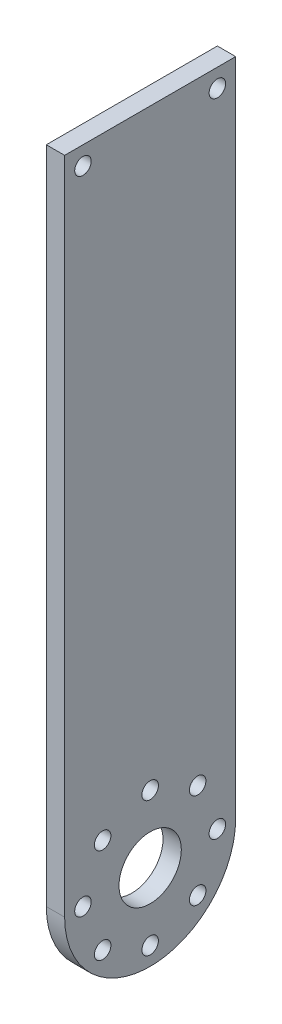
ISO-10303-21;
HEADER;
FILE_DESCRIPTION(('STEP AP214'),'2;1');
FILE_NAME('part.step','',(''),(''),'','','');
FILE_SCHEMA(('AUTOMOTIVE_DESIGN { 1 0 10303 214 1 1 1 1 }'));
ENDSEC;
DATA;
#1=APPLICATION_CONTEXT('core data for automotive mechanical design processes');
#2=APPLICATION_PROTOCOL_DEFINITION('international standard','automotive_design',2000,#1);
#3=PRODUCT_CONTEXT('',#1,'mechanical');
#4=PRODUCT('Part','Part','',(#3));
#5=PRODUCT_RELATED_PRODUCT_CATEGORY('part','',(#4));
#6=PRODUCT_DEFINITION_FORMATION('','',#4);
#7=PRODUCT_DEFINITION_CONTEXT('part definition',#1,'design');
#8=PRODUCT_DEFINITION('design','',#6,#7);
#9=PRODUCT_DEFINITION_SHAPE('','',#8);
#10=(LENGTH_UNIT() NAMED_UNIT(*) SI_UNIT(.MILLI.,.METRE.));
#11=(NAMED_UNIT(*) PLANE_ANGLE_UNIT() SI_UNIT($,.RADIAN.));
#12=(NAMED_UNIT(*) SI_UNIT($,.STERADIAN.) SOLID_ANGLE_UNIT());
#13=UNCERTAINTY_MEASURE_WITH_UNIT(LENGTH_MEASURE(1.E-05),#10,'distance_accuracy_value','');
#14=(GEOMETRIC_REPRESENTATION_CONTEXT(3) GLOBAL_UNCERTAINTY_ASSIGNED_CONTEXT((#13)) GLOBAL_UNIT_ASSIGNED_CONTEXT((#10,
#11,#12)) REPRESENTATION_CONTEXT('',''));
#15=CARTESIAN_POINT('',(0.,0.,0.));
#16=DIRECTION('',(0.,0.,1.));
#17=DIRECTION('',(1.,0.,0.));
#18=AXIS2_PLACEMENT_3D('',#15,#16,#17);
#19=CARTESIAN_POINT('',(3.,0.,0.));
#20=DIRECTION('',(1.,0.,0.));
#21=DIRECTION('',(0.,0.,-1.));
#22=AXIS2_PLACEMENT_3D('',#19,#20,#21);
#23=PLANE('',#22);
#24=CARTESIAN_POINT('',(3.,105.,11.));
#25=DIRECTION('',(1.,0.,0.));
#26=DIRECTION('',(0.,0.,-1.));
#27=AXIS2_PLACEMENT_3D('',#24,#25,#26);
#28=CIRCLE('',#27,1.35);
#29=CARTESIAN_POINT('',(3.,105.,9.65));
#30=VERTEX_POINT('',#29);
#31=EDGE_CURVE('E164',#30,#30,#28,.T.);
#32=ORIENTED_EDGE('',*,*,#31,.F.);
#33=EDGE_LOOP('',(#32));
#34=FACE_BOUND('',#33,.T.);
#35=CARTESIAN_POINT('',(3.,-1.15218884181823E-13,-11.));
#36=DIRECTION('',(1.,0.,0.));
#37=DIRECTION('',(0.,0.,-1.));
#38=AXIS2_PLACEMENT_3D('',#35,#36,#37);
#39=CIRCLE('',#38,1.35);
#40=CARTESIAN_POINT('',(3.,-1.15218884181823E-13,-12.35));
#41=VERTEX_POINT('',#40);
#42=EDGE_CURVE('E152',#41,#41,#39,.T.);
#43=ORIENTED_EDGE('',*,*,#42,.F.);
#44=EDGE_LOOP('',(#43));
#45=FACE_BOUND('',#44,.T.);
#46=CARTESIAN_POINT('',(3.,11.,0.));
#47=DIRECTION('',(1.,0.,0.));
#48=DIRECTION('',(0.,0.,-1.));
#49=AXIS2_PLACEMENT_3D('',#46,#47,#48);
#50=CIRCLE('',#49,1.35);
#51=CARTESIAN_POINT('',(3.,11.,-1.35000000000008));
#52=VERTEX_POINT('',#51);
#53=EDGE_CURVE('E140',#52,#52,#50,.T.);
#54=ORIENTED_EDGE('',*,*,#53,.F.);
#55=EDGE_LOOP('',(#54));
#56=FACE_BOUND('',#55,.T.);
#57=CARTESIAN_POINT('',(3.,0.,11.));
#58=DIRECTION('',(1.,0.,0.));
#59=DIRECTION('',(0.,0.,-1.));
#60=AXIS2_PLACEMENT_3D('',#57,#58,#59);
#61=CIRCLE('',#60,1.35);
#62=CARTESIAN_POINT('',(3.,0.,9.65));
#63=VERTEX_POINT('',#62);
#64=EDGE_CURVE('E128',#63,#63,#61,.T.);
#65=ORIENTED_EDGE('',*,*,#64,.F.);
#66=EDGE_LOOP('',(#65));
#67=FACE_BOUND('',#66,.T.);
#68=CARTESIAN_POINT('',(3.,0.,0.));
#69=DIRECTION('',(1.,0.,0.));
#70=DIRECTION('',(0.,0.,-1.));
#71=AXIS2_PLACEMENT_3D('',#68,#69,#70);
#72=CIRCLE('',#71,5.1);
#73=CARTESIAN_POINT('',(3.,0.,-5.1));
#74=VERTEX_POINT('',#73);
#75=EDGE_CURVE('E116',#74,#74,#72,.T.);
#76=ORIENTED_EDGE('',*,*,#75,.F.);
#77=EDGE_LOOP('',(#76));
#78=FACE_BOUND('',#77,.T.);
#79=CARTESIAN_POINT('',(3.,0.,0.));
#80=DIRECTION('',(1.,0.,0.));
#81=DIRECTION('',(0.,0.,-1.));
#82=AXIS2_PLACEMENT_3D('',#79,#80,#81);
#83=CIRCLE('',#82,14.);
#84=CARTESIAN_POINT('',(3.,0.,14.));
#85=VERTEX_POINT('',#84);
#86=CARTESIAN_POINT('',(3.,0.,-14.));
#87=VERTEX_POINT('',#86);
#88=EDGE_CURVE('E86',#85,#87,#83,.T.);
#89=ORIENTED_EDGE('',*,*,#88,.T.);
#90=DIRECTION('',(0.,1.,0.));
#91=VECTOR('',#90,1.);
#92=CARTESIAN_POINT('',(3.,0.,-14.));
#93=LINE('',#92,#91);
#94=CARTESIAN_POINT('',(3.,108.,-14.));
#95=VERTEX_POINT('',#94);
#96=EDGE_CURVE('E81',#87,#95,#93,.T.);
#97=ORIENTED_EDGE('',*,*,#96,.T.);
#98=DIRECTION('',(0.,0.,1.));
#99=VECTOR('',#98,1.);
#100=CARTESIAN_POINT('',(3.,108.,14.));
#101=LINE('',#100,#99);
#102=CARTESIAN_POINT('',(3.,108.,14.));
#103=VERTEX_POINT('',#102);
#104=EDGE_CURVE('E84',#95,#103,#101,.T.);
#105=ORIENTED_EDGE('',*,*,#104,.T.);
#106=DIRECTION('',(0.,-1.,0.));
#107=VECTOR('',#106,1.);
#108=CARTESIAN_POINT('',(3.,0.,14.));
#109=LINE('',#108,#107);
#110=EDGE_CURVE('E51',#103,#85,#109,.T.);
#111=ORIENTED_EDGE('',*,*,#110,.T.);
#112=EDGE_LOOP('',(#89,#97,#105,#111));
#113=FACE_BOUND('',#112,.T.);
#114=CARTESIAN_POINT('',(3.,-11.,0.));
#115=DIRECTION('',(1.,0.,0.));
#116=DIRECTION('',(0.,0.,-1.));
#117=AXIS2_PLACEMENT_3D('',#114,#115,#116);
#118=CIRCLE('',#117,1.35);
#119=CARTESIAN_POINT('',(3.,-11.,-1.35));
#120=VERTEX_POINT('',#119);
#121=EDGE_CURVE('E101',#120,#120,#118,.T.);
#122=ORIENTED_EDGE('',*,*,#121,.F.);
#123=EDGE_LOOP('',(#122));
#124=FACE_BOUND('',#123,.T.);
#125=CARTESIAN_POINT('',(3.,-7.77817459305201,7.77817459305203));
#126=DIRECTION('',(1.,0.,0.));
#127=DIRECTION('',(0.,0.,-1.));
#128=AXIS2_PLACEMENT_3D('',#125,#126,#127);
#129=CIRCLE('',#128,1.35);
#130=CARTESIAN_POINT('',(3.,-7.77817459305201,6.42817459305203));
#131=VERTEX_POINT('',#130);
#132=EDGE_CURVE('E122',#131,#131,#129,.T.);
#133=ORIENTED_EDGE('',*,*,#132,.F.);
#134=EDGE_LOOP('',(#133));
#135=FACE_BOUND('',#134,.T.);
#136=CARTESIAN_POINT('',(3.,7.77817459305206,7.77817459305199));
#137=DIRECTION('',(1.,0.,0.));
#138=DIRECTION('',(0.,0.,-1.));
#139=AXIS2_PLACEMENT_3D('',#136,#137,#138);
#140=CIRCLE('',#139,1.35);
#141=CARTESIAN_POINT('',(3.,7.77817459305206,6.42817459305199));
#142=VERTEX_POINT('',#141);
#143=EDGE_CURVE('E134',#142,#142,#140,.T.);
#144=ORIENTED_EDGE('',*,*,#143,.F.);
#145=EDGE_LOOP('',(#144));
#146=FACE_BOUND('',#145,.T.);
#147=CARTESIAN_POINT('',(3.,7.77817459305195,-7.77817459305209));
#148=DIRECTION('',(1.,0.,0.));
#149=DIRECTION('',(0.,0.,-1.));
#150=AXIS2_PLACEMENT_3D('',#147,#148,#149);
#151=CIRCLE('',#150,1.35);
#152=CARTESIAN_POINT('',(3.,7.77817459305195,-9.12817459305209));
#153=VERTEX_POINT('',#152);
#154=EDGE_CURVE('E146',#153,#153,#151,.T.);
#155=ORIENTED_EDGE('',*,*,#154,.F.);
#156=EDGE_LOOP('',(#155));
#157=FACE_BOUND('',#156,.T.);
#158=CARTESIAN_POINT('',(3.,-7.77817459305212,-7.77817459305193));
#159=DIRECTION('',(1.,0.,0.));
#160=DIRECTION('',(0.,0.,-1.));
#161=AXIS2_PLACEMENT_3D('',#158,#159,#160);
#162=CIRCLE('',#161,1.35);
#163=CARTESIAN_POINT('',(3.,-7.77817459305212,-9.12817459305193));
#164=VERTEX_POINT('',#163);
#165=EDGE_CURVE('E158',#164,#164,#162,.T.);
#166=ORIENTED_EDGE('',*,*,#165,.F.);
#167=EDGE_LOOP('',(#166));
#168=FACE_BOUND('',#167,.T.);
#169=CARTESIAN_POINT('',(3.,105.,-11.));
#170=DIRECTION('',(1.,0.,0.));
#171=DIRECTION('',(0.,0.,1.));
#172=AXIS2_PLACEMENT_3D('',#169,#170,#171);
#173=CIRCLE('',#172,1.35);
#174=CARTESIAN_POINT('',(3.,105.,-9.65));
#175=VERTEX_POINT('',#174);
#176=EDGE_CURVE('E170',#175,#175,#173,.T.);
#177=ORIENTED_EDGE('',*,*,#176,.F.);
#178=EDGE_LOOP('',(#177));
#179=FACE_BOUND('',#178,.T.);
#180=ADVANCED_FACE('F34',(#34,#45,#56,#67,#78,#113,#124,#135,#146,#157,#168,#179),#23,.T.);
#181=CARTESIAN_POINT('',(0.,0.,0.));
#182=DIRECTION('',(1.,0.,0.));
#183=DIRECTION('',(0.,0.,-1.));
#184=AXIS2_PLACEMENT_3D('',#181,#182,#183);
#185=PLANE('',#184);
#186=CARTESIAN_POINT('',(0.,0.,0.));
#187=DIRECTION('',(1.,0.,0.));
#188=DIRECTION('',(0.,0.,-1.));
#189=AXIS2_PLACEMENT_3D('',#186,#187,#188);
#190=CIRCLE('',#189,14.);
#191=CARTESIAN_POINT('',(0.,0.,14.));
#192=VERTEX_POINT('',#191);
#193=CARTESIAN_POINT('',(0.,0.,-14.));
#194=VERTEX_POINT('',#193);
#195=EDGE_CURVE('E98',#192,#194,#190,.T.);
#196=ORIENTED_EDGE('',*,*,#195,.F.);
#197=DIRECTION('',(0.,-1.,0.));
#198=VECTOR('',#197,1.);
#199=CARTESIAN_POINT('',(0.,0.,14.));
#200=LINE('',#199,#198);
#201=CARTESIAN_POINT('',(0.,108.,14.));
#202=VERTEX_POINT('',#201);
#203=EDGE_CURVE('E74',#202,#192,#200,.T.);
#204=ORIENTED_EDGE('',*,*,#203,.F.);
#205=DIRECTION('',(0.,0.,1.));
#206=VECTOR('',#205,1.);
#207=CARTESIAN_POINT('',(0.,108.,14.));
#208=LINE('',#207,#206);
#209=CARTESIAN_POINT('',(0.,108.,-14.));
#210=VERTEX_POINT('',#209);
#211=EDGE_CURVE('E68',#210,#202,#208,.T.);
#212=ORIENTED_EDGE('',*,*,#211,.F.);
#213=DIRECTION('',(0.,1.,0.));
#214=VECTOR('',#213,1.);
#215=CARTESIAN_POINT('',(0.,0.,-14.));
#216=LINE('',#215,#214);
#217=EDGE_CURVE('E90',#194,#210,#216,.T.);
#218=ORIENTED_EDGE('',*,*,#217,.F.);
#219=EDGE_LOOP('',(#196,#204,#212,#218));
#220=FACE_BOUND('',#219,.T.);
#221=CARTESIAN_POINT('',(0.,-11.,0.));
#222=DIRECTION('',(1.,0.,0.));
#223=DIRECTION('',(0.,0.,-1.));
#224=AXIS2_PLACEMENT_3D('',#221,#222,#223);
#225=CIRCLE('',#224,1.35);
#226=CARTESIAN_POINT('',(0.,-11.,-1.35));
#227=VERTEX_POINT('',#226);
#228=EDGE_CURVE('E113',#227,#227,#225,.T.);
#229=ORIENTED_EDGE('',*,*,#228,.T.);
#230=EDGE_LOOP('',(#229));
#231=FACE_BOUND('',#230,.T.);
#232=CARTESIAN_POINT('',(0.,0.,0.));
#233=DIRECTION('',(1.,0.,0.));
#234=DIRECTION('',(0.,0.,-1.));
#235=AXIS2_PLACEMENT_3D('',#232,#233,#234);
#236=CIRCLE('',#235,5.1);
#237=CARTESIAN_POINT('',(0.,0.,-5.1));
#238=VERTEX_POINT('',#237);
#239=EDGE_CURVE('E119',#238,#238,#236,.T.);
#240=ORIENTED_EDGE('',*,*,#239,.T.);
#241=EDGE_LOOP('',(#240));
#242=FACE_BOUND('',#241,.T.);
#243=CARTESIAN_POINT('',(0.,-7.77817459305201,7.77817459305203));
#244=DIRECTION('',(1.,0.,0.));
#245=DIRECTION('',(0.,0.,-1.));
#246=AXIS2_PLACEMENT_3D('',#243,#244,#245);
#247=CIRCLE('',#246,1.35);
#248=CARTESIAN_POINT('',(0.,-7.77817459305201,6.42817459305203));
#249=VERTEX_POINT('',#248);
#250=EDGE_CURVE('E125',#249,#249,#247,.T.);
#251=ORIENTED_EDGE('',*,*,#250,.T.);
#252=EDGE_LOOP('',(#251));
#253=FACE_BOUND('',#252,.T.);
#254=CARTESIAN_POINT('',(0.,0.,11.));
#255=DIRECTION('',(1.,0.,0.));
#256=DIRECTION('',(0.,0.,-1.));
#257=AXIS2_PLACEMENT_3D('',#254,#255,#256);
#258=CIRCLE('',#257,1.35);
#259=CARTESIAN_POINT('',(0.,0.,9.65));
#260=VERTEX_POINT('',#259);
#261=EDGE_CURVE('E131',#260,#260,#258,.T.);
#262=ORIENTED_EDGE('',*,*,#261,.T.);
#263=EDGE_LOOP('',(#262));
#264=FACE_BOUND('',#263,.T.);
#265=CARTESIAN_POINT('',(0.,7.77817459305206,7.77817459305199));
#266=DIRECTION('',(1.,0.,0.));
#267=DIRECTION('',(0.,0.,-1.));
#268=AXIS2_PLACEMENT_3D('',#265,#266,#267);
#269=CIRCLE('',#268,1.35);
#270=CARTESIAN_POINT('',(0.,7.77817459305206,6.42817459305199));
#271=VERTEX_POINT('',#270);
#272=EDGE_CURVE('E137',#271,#271,#269,.T.);
#273=ORIENTED_EDGE('',*,*,#272,.T.);
#274=EDGE_LOOP('',(#273));
#275=FACE_BOUND('',#274,.T.);
#276=CARTESIAN_POINT('',(0.,11.,0.));
#277=DIRECTION('',(1.,0.,0.));
#278=DIRECTION('',(0.,0.,-1.));
#279=AXIS2_PLACEMENT_3D('',#276,#277,#278);
#280=CIRCLE('',#279,1.35);
#281=CARTESIAN_POINT('',(0.,11.,-1.35000000000008));
#282=VERTEX_POINT('',#281);
#283=EDGE_CURVE('E143',#282,#282,#280,.T.);
#284=ORIENTED_EDGE('',*,*,#283,.T.);
#285=EDGE_LOOP('',(#284));
#286=FACE_BOUND('',#285,.T.);
#287=CARTESIAN_POINT('',(0.,7.77817459305195,-7.77817459305209));
#288=DIRECTION('',(1.,0.,0.));
#289=DIRECTION('',(0.,0.,-1.));
#290=AXIS2_PLACEMENT_3D('',#287,#288,#289);
#291=CIRCLE('',#290,1.35);
#292=CARTESIAN_POINT('',(0.,7.77817459305195,-9.12817459305209));
#293=VERTEX_POINT('',#292);
#294=EDGE_CURVE('E149',#293,#293,#291,.T.);
#295=ORIENTED_EDGE('',*,*,#294,.T.);
#296=EDGE_LOOP('',(#295));
#297=FACE_BOUND('',#296,.T.);
#298=CARTESIAN_POINT('',(0.,-1.15218884181823E-13,-11.));
#299=DIRECTION('',(1.,0.,0.));
#300=DIRECTION('',(0.,0.,-1.));
#301=AXIS2_PLACEMENT_3D('',#298,#299,#300);
#302=CIRCLE('',#301,1.35);
#303=CARTESIAN_POINT('',(0.,-1.15218884181823E-13,-12.35));
#304=VERTEX_POINT('',#303);
#305=EDGE_CURVE('E155',#304,#304,#302,.T.);
#306=ORIENTED_EDGE('',*,*,#305,.T.);
#307=EDGE_LOOP('',(#306));
#308=FACE_BOUND('',#307,.T.);
#309=CARTESIAN_POINT('',(0.,-7.77817459305212,-7.77817459305193));
#310=DIRECTION('',(1.,0.,0.));
#311=DIRECTION('',(0.,0.,-1.));
#312=AXIS2_PLACEMENT_3D('',#309,#310,#311);
#313=CIRCLE('',#312,1.35);
#314=CARTESIAN_POINT('',(0.,-7.77817459305212,-9.12817459305193));
#315=VERTEX_POINT('',#314);
#316=EDGE_CURVE('E161',#315,#315,#313,.T.);
#317=ORIENTED_EDGE('',*,*,#316,.T.);
#318=EDGE_LOOP('',(#317));
#319=FACE_BOUND('',#318,.T.);
#320=CARTESIAN_POINT('',(0.,105.,11.));
#321=DIRECTION('',(1.,0.,0.));
#322=DIRECTION('',(0.,0.,-1.));
#323=AXIS2_PLACEMENT_3D('',#320,#321,#322);
#324=CIRCLE('',#323,1.35);
#325=CARTESIAN_POINT('',(0.,105.,9.65));
#326=VERTEX_POINT('',#325);
#327=EDGE_CURVE('E167',#326,#326,#324,.T.);
#328=ORIENTED_EDGE('',*,*,#327,.T.);
#329=EDGE_LOOP('',(#328));
#330=FACE_BOUND('',#329,.T.);
#331=CARTESIAN_POINT('',(0.,105.,-11.));
#332=DIRECTION('',(1.,0.,0.));
#333=DIRECTION('',(0.,0.,1.));
#334=AXIS2_PLACEMENT_3D('',#331,#332,#333);
#335=CIRCLE('',#334,1.35);
#336=CARTESIAN_POINT('',(0.,105.,-9.65));
#337=VERTEX_POINT('',#336);
#338=EDGE_CURVE('E173',#337,#337,#335,.T.);
#339=ORIENTED_EDGE('',*,*,#338,.T.);
#340=EDGE_LOOP('',(#339));
#341=FACE_BOUND('',#340,.T.);
#342=ADVANCED_FACE('F109',(#220,#231,#242,#253,#264,#275,#286,#297,#308,#319,#330,#341),#185,.F.);
#343=CARTESIAN_POINT('',(3.,0.,0.));
#344=DIRECTION('',(-1.,0.,0.));
#345=DIRECTION('',(0.,0.,1.));
#346=AXIS2_PLACEMENT_3D('',#343,#344,#345);
#347=CYLINDRICAL_SURFACE('',#346,14.);
#348=ORIENTED_EDGE('',*,*,#195,.T.);
#349=DIRECTION('',(-1.,0.,0.));
#350=VECTOR('',#349,1.);
#351=CARTESIAN_POINT('',(3.,0.,-14.));
#352=LINE('',#351,#350);
#353=EDGE_CURVE('E11',#87,#194,#352,.T.);
#354=ORIENTED_EDGE('',*,*,#353,.F.);
#355=ORIENTED_EDGE('',*,*,#88,.F.);
#356=DIRECTION('',(-1.,0.,0.));
#357=VECTOR('',#356,1.);
#358=CARTESIAN_POINT('',(3.,0.,14.));
#359=LINE('',#358,#357);
#360=EDGE_CURVE('E94',#85,#192,#359,.T.);
#361=ORIENTED_EDGE('',*,*,#360,.T.);
#362=EDGE_LOOP('',(#348,#354,#355,#361));
#363=FACE_BOUND('',#362,.T.);
#364=ADVANCED_FACE('F36',(#363),#347,.T.);
#365=CARTESIAN_POINT('',(3.,0.,-14.));
#366=DIRECTION('',(0.,0.,1.));
#367=DIRECTION('',(0.,-1.,0.));
#368=AXIS2_PLACEMENT_3D('',#365,#366,#367);
#369=PLANE('',#368);
#370=ORIENTED_EDGE('',*,*,#217,.T.);
#371=DIRECTION('',(-1.,0.,0.));
#372=VECTOR('',#371,1.);
#373=CARTESIAN_POINT('',(3.,108.,-14.));
#374=LINE('',#373,#372);
#375=EDGE_CURVE('E43',#95,#210,#374,.T.);
#376=ORIENTED_EDGE('',*,*,#375,.F.);
#377=ORIENTED_EDGE('',*,*,#96,.F.);
#378=ORIENTED_EDGE('',*,*,#353,.T.);
#379=EDGE_LOOP('',(#370,#376,#377,#378));
#380=FACE_BOUND('',#379,.T.);
#381=ADVANCED_FACE('F89',(#380),#369,.F.);
#382=CARTESIAN_POINT('',(3.,108.,14.));
#383=DIRECTION('',(0.,-1.,0.));
#384=DIRECTION('',(0.,0.,-1.));
#385=AXIS2_PLACEMENT_3D('',#382,#383,#384);
#386=PLANE('',#385);
#387=ORIENTED_EDGE('',*,*,#211,.T.);
#388=DIRECTION('',(-1.,0.,0.));
#389=VECTOR('',#388,1.);
#390=CARTESIAN_POINT('',(3.,108.,14.));
#391=LINE('',#390,#389);
#392=EDGE_CURVE('E91',#103,#202,#391,.T.);
#393=ORIENTED_EDGE('',*,*,#392,.F.);
#394=ORIENTED_EDGE('',*,*,#104,.F.);
#395=ORIENTED_EDGE('',*,*,#375,.T.);
#396=EDGE_LOOP('',(#387,#393,#394,#395));
#397=FACE_BOUND('',#396,.T.);
#398=ADVANCED_FACE('F92',(#397),#386,.F.);
#399=CARTESIAN_POINT('',(3.,0.,14.));
#400=DIRECTION('',(0.,0.,-1.));
#401=DIRECTION('',(0.,1.,0.));
#402=AXIS2_PLACEMENT_3D('',#399,#400,#401);
#403=PLANE('',#402);
#404=ORIENTED_EDGE('',*,*,#203,.T.);
#405=ORIENTED_EDGE('',*,*,#360,.F.);
#406=ORIENTED_EDGE('',*,*,#110,.F.);
#407=ORIENTED_EDGE('',*,*,#392,.T.);
#408=EDGE_LOOP('',(#404,#405,#406,#407));
#409=FACE_BOUND('',#408,.T.);
#410=ADVANCED_FACE('F106',(#409),#403,.F.);
#411=CARTESIAN_POINT('',(3.,-11.,0.));
#412=DIRECTION('',(-1.,0.,0.));
#413=DIRECTION('',(0.,0.,1.));
#414=AXIS2_PLACEMENT_3D('',#411,#412,#413);
#415=CYLINDRICAL_SURFACE('',#414,1.35);
#416=ORIENTED_EDGE('',*,*,#121,.T.);
#417=EDGE_LOOP('',(#416));
#418=FACE_BOUND('',#417,.T.);
#419=ORIENTED_EDGE('',*,*,#228,.F.);
#420=EDGE_LOOP('',(#419));
#421=FACE_BOUND('',#420,.T.);
#422=ADVANCED_FACE('F192',(#418,#421),#415,.F.);
#423=CARTESIAN_POINT('',(3.,0.,0.));
#424=DIRECTION('',(-1.,0.,0.));
#425=DIRECTION('',(0.,0.,1.));
#426=AXIS2_PLACEMENT_3D('',#423,#424,#425);
#427=CYLINDRICAL_SURFACE('',#426,5.1);
#428=ORIENTED_EDGE('',*,*,#75,.T.);
#429=EDGE_LOOP('',(#428));
#430=FACE_BOUND('',#429,.T.);
#431=ORIENTED_EDGE('',*,*,#239,.F.);
#432=EDGE_LOOP('',(#431));
#433=FACE_BOUND('',#432,.T.);
#434=ADVANCED_FACE('F238',(#430,#433),#427,.F.);
#435=CARTESIAN_POINT('',(3.,-7.77817459305201,7.77817459305203));
#436=DIRECTION('',(-1.,0.,0.));
#437=DIRECTION('',(0.,0.,1.));
#438=AXIS2_PLACEMENT_3D('',#435,#436,#437);
#439=CYLINDRICAL_SURFACE('',#438,1.35);
#440=ORIENTED_EDGE('',*,*,#132,.T.);
#441=EDGE_LOOP('',(#440));
#442=FACE_BOUND('',#441,.T.);
#443=ORIENTED_EDGE('',*,*,#250,.F.);
#444=EDGE_LOOP('',(#443));
#445=FACE_BOUND('',#444,.T.);
#446=ADVANCED_FACE('F246',(#442,#445),#439,.F.);
#447=CARTESIAN_POINT('',(3.,0.,11.));
#448=DIRECTION('',(-1.,0.,0.));
#449=DIRECTION('',(0.,0.,1.));
#450=AXIS2_PLACEMENT_3D('',#447,#448,#449);
#451=CYLINDRICAL_SURFACE('',#450,1.35);
#452=ORIENTED_EDGE('',*,*,#64,.T.);
#453=EDGE_LOOP('',(#452));
#454=FACE_BOUND('',#453,.T.);
#455=ORIENTED_EDGE('',*,*,#261,.F.);
#456=EDGE_LOOP('',(#455));
#457=FACE_BOUND('',#456,.T.);
#458=ADVANCED_FACE('F254',(#454,#457),#451,.F.);
#459=CARTESIAN_POINT('',(3.,7.77817459305206,7.77817459305199));
#460=DIRECTION('',(-1.,0.,0.));
#461=DIRECTION('',(0.,0.,1.));
#462=AXIS2_PLACEMENT_3D('',#459,#460,#461);
#463=CYLINDRICAL_SURFACE('',#462,1.35);
#464=ORIENTED_EDGE('',*,*,#143,.T.);
#465=EDGE_LOOP('',(#464));
#466=FACE_BOUND('',#465,.T.);
#467=ORIENTED_EDGE('',*,*,#272,.F.);
#468=EDGE_LOOP('',(#467));
#469=FACE_BOUND('',#468,.T.);
#470=ADVANCED_FACE('F263',(#466,#469),#463,.F.);
#471=CARTESIAN_POINT('',(3.,11.,0.));
#472=DIRECTION('',(-1.,0.,0.));
#473=DIRECTION('',(0.,0.,1.));
#474=AXIS2_PLACEMENT_3D('',#471,#472,#473);
#475=CYLINDRICAL_SURFACE('',#474,1.35);
#476=ORIENTED_EDGE('',*,*,#53,.T.);
#477=EDGE_LOOP('',(#476));
#478=FACE_BOUND('',#477,.T.);
#479=ORIENTED_EDGE('',*,*,#283,.F.);
#480=EDGE_LOOP('',(#479));
#481=FACE_BOUND('',#480,.T.);
#482=ADVANCED_FACE('F272',(#478,#481),#475,.F.);
#483=CARTESIAN_POINT('',(3.,7.77817459305195,-7.77817459305209));
#484=DIRECTION('',(-1.,0.,0.));
#485=DIRECTION('',(0.,0.,1.));
#486=AXIS2_PLACEMENT_3D('',#483,#484,#485);
#487=CYLINDRICAL_SURFACE('',#486,1.35);
#488=ORIENTED_EDGE('',*,*,#154,.T.);
#489=EDGE_LOOP('',(#488));
#490=FACE_BOUND('',#489,.T.);
#491=ORIENTED_EDGE('',*,*,#294,.F.);
#492=EDGE_LOOP('',(#491));
#493=FACE_BOUND('',#492,.T.);
#494=ADVANCED_FACE('F281',(#490,#493),#487,.F.);
#495=CARTESIAN_POINT('',(3.,-1.15218884181823E-13,-11.));
#496=DIRECTION('',(-1.,0.,0.));
#497=DIRECTION('',(0.,0.,1.));
#498=AXIS2_PLACEMENT_3D('',#495,#496,#497);
#499=CYLINDRICAL_SURFACE('',#498,1.35);
#500=ORIENTED_EDGE('',*,*,#42,.T.);
#501=EDGE_LOOP('',(#500));
#502=FACE_BOUND('',#501,.T.);
#503=ORIENTED_EDGE('',*,*,#305,.F.);
#504=EDGE_LOOP('',(#503));
#505=FACE_BOUND('',#504,.T.);
#506=ADVANCED_FACE('F290',(#502,#505),#499,.F.);
#507=CARTESIAN_POINT('',(3.,-7.77817459305212,-7.77817459305193));
#508=DIRECTION('',(-1.,0.,0.));
#509=DIRECTION('',(0.,0.,1.));
#510=AXIS2_PLACEMENT_3D('',#507,#508,#509);
#511=CYLINDRICAL_SURFACE('',#510,1.35);
#512=ORIENTED_EDGE('',*,*,#165,.T.);
#513=EDGE_LOOP('',(#512));
#514=FACE_BOUND('',#513,.T.);
#515=ORIENTED_EDGE('',*,*,#316,.F.);
#516=EDGE_LOOP('',(#515));
#517=FACE_BOUND('',#516,.T.);
#518=ADVANCED_FACE('F299',(#514,#517),#511,.F.);
#519=CARTESIAN_POINT('',(3.,105.,11.));
#520=DIRECTION('',(-1.,0.,0.));
#521=DIRECTION('',(0.,0.,1.));
#522=AXIS2_PLACEMENT_3D('',#519,#520,#521);
#523=CYLINDRICAL_SURFACE('',#522,1.35);
#524=ORIENTED_EDGE('',*,*,#31,.T.);
#525=EDGE_LOOP('',(#524));
#526=FACE_BOUND('',#525,.T.);
#527=ORIENTED_EDGE('',*,*,#327,.F.);
#528=EDGE_LOOP('',(#527));
#529=FACE_BOUND('',#528,.T.);
#530=ADVANCED_FACE('F308',(#526,#529),#523,.F.);
#531=CARTESIAN_POINT('',(3.,105.,-11.));
#532=DIRECTION('',(-1.,0.,0.));
#533=DIRECTION('',(0.,0.,1.));
#534=AXIS2_PLACEMENT_3D('',#531,#532,#533);
#535=CYLINDRICAL_SURFACE('',#534,1.35);
#536=ORIENTED_EDGE('',*,*,#176,.T.);
#537=EDGE_LOOP('',(#536));
#538=FACE_BOUND('',#537,.T.);
#539=ORIENTED_EDGE('',*,*,#338,.F.);
#540=EDGE_LOOP('',(#539));
#541=FACE_BOUND('',#540,.T.);
#542=ADVANCED_FACE('F179',(#538,#541),#535,.F.);
#543=CLOSED_SHELL('',(#180,#342,#364,#381,#398,#410,#422,#434,#446,#458,#470,#482,#494,#506,
#518,#530,#542));
#544=MANIFOLD_SOLID_BREP('B2',#543);
#545=ADVANCED_BREP_SHAPE_REPRESENTATION('',(#18,#544),#14);
#546=SHAPE_DEFINITION_REPRESENTATION(#9,#545);
ENDSEC;
END-ISO-10303-21;
